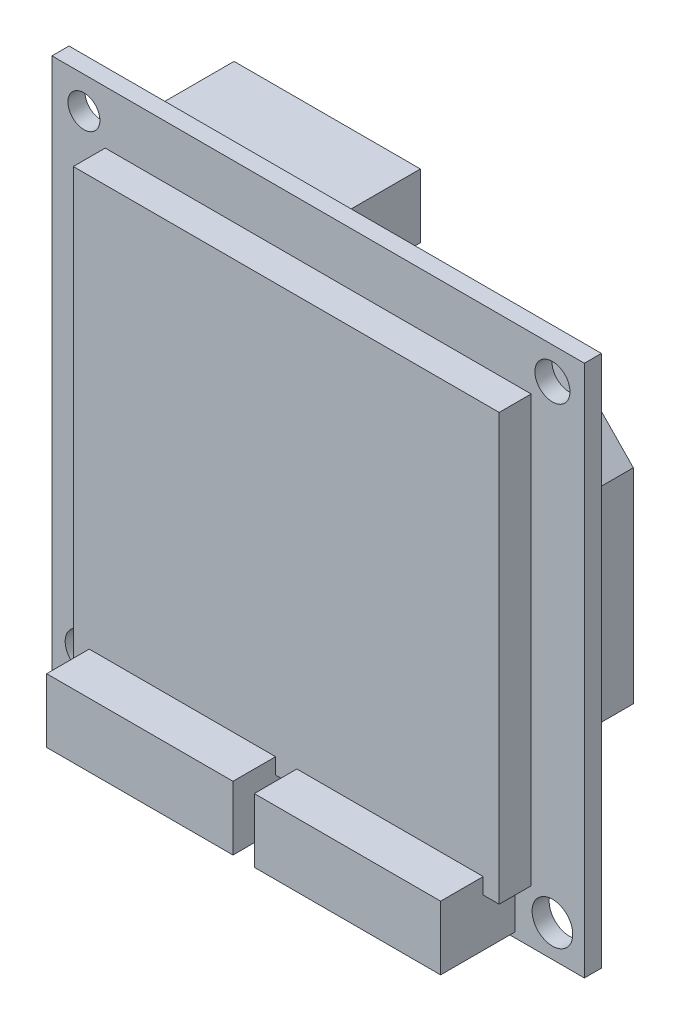
ISO-10303-21;
HEADER;
FILE_DESCRIPTION(('STEP AP214'),'2;1');
FILE_NAME('part.step','',(''),(''),'','','');
FILE_SCHEMA(('AUTOMOTIVE_DESIGN { 1 0 10303 214 1 1 1 1 }'));
ENDSEC;
DATA;
#1=APPLICATION_CONTEXT('core data for automotive mechanical design processes');
#2=APPLICATION_PROTOCOL_DEFINITION('international standard','automotive_design',2000,#1);
#3=PRODUCT_CONTEXT('',#1,'mechanical');
#4=PRODUCT('Part','Part','',(#3));
#5=PRODUCT_RELATED_PRODUCT_CATEGORY('part','',(#4));
#6=PRODUCT_DEFINITION_FORMATION('','',#4);
#7=PRODUCT_DEFINITION_CONTEXT('part definition',#1,'design');
#8=PRODUCT_DEFINITION('design','',#6,#7);
#9=PRODUCT_DEFINITION_SHAPE('','',#8);
#10=(LENGTH_UNIT() NAMED_UNIT(*) SI_UNIT(.MILLI.,.METRE.));
#11=(NAMED_UNIT(*) PLANE_ANGLE_UNIT() SI_UNIT($,.RADIAN.));
#12=(NAMED_UNIT(*) SI_UNIT($,.STERADIAN.) SOLID_ANGLE_UNIT());
#13=UNCERTAINTY_MEASURE_WITH_UNIT(LENGTH_MEASURE(1.E-05),#10,'distance_accuracy_value','');
#14=(GEOMETRIC_REPRESENTATION_CONTEXT(3) GLOBAL_UNCERTAINTY_ASSIGNED_CONTEXT((#13)) GLOBAL_UNIT_ASSIGNED_CONTEXT((#10,
#11,#12)) REPRESENTATION_CONTEXT('',''));
#15=CARTESIAN_POINT('',(0.,0.,0.));
#16=DIRECTION('',(0.,0.,1.));
#17=DIRECTION('',(1.,0.,0.));
#18=AXIS2_PLACEMENT_3D('',#15,#16,#17);
#19=CARTESIAN_POINT('',(0.,-55.1414213562373,-0.8));
#20=DIRECTION('',(0.,0.,1.));
#21=DIRECTION('',(1.,0.,0.));
#22=AXIS2_PLACEMENT_3D('',#19,#20,#21);
#23=PLANE('',#22);
#24=DIRECTION('',(-1.,0.,0.));
#25=VECTOR('',#24,1.);
#26=CARTESIAN_POINT('',(-4.00000000000001,-9.99999999999999,-0.8));
#27=LINE('',#26,#25);
#28=CARTESIAN_POINT('',(20.,-10.,-0.8));
#29=VERTEX_POINT('',#28);
#30=CARTESIAN_POINT('',(-4.00000000000001,-9.99999999999999,-0.8));
#31=VERTEX_POINT('',#30);
#32=EDGE_CURVE('E318',#29,#31,#27,.T.);
#33=ORIENTED_EDGE('',*,*,#32,.F.);
#34=DIRECTION('',(0.,-1.,0.));
#35=VECTOR('',#34,1.);
#36=CARTESIAN_POINT('',(20.,-10.,-0.8));
#37=LINE('',#36,#35);
#38=CARTESIAN_POINT('',(20.,9.19999999999999,-0.8));
#39=VERTEX_POINT('',#38);
#40=EDGE_CURVE('E323',#39,#29,#37,.T.);
#41=ORIENTED_EDGE('',*,*,#40,.F.);
#42=DIRECTION('',(0.697864726910429,-0.716229588144914,0.));
#43=VECTOR('',#42,1.);
#44=CARTESIAN_POINT('',(20.,9.2,-0.8));
#45=LINE('',#44,#43);
#46=CARTESIAN_POINT('',(12.4,17.,-0.8));
#47=VERTEX_POINT('',#46);
#48=EDGE_CURVE('E345',#47,#39,#45,.T.);
#49=ORIENTED_EDGE('',*,*,#48,.F.);
#50=DIRECTION('',(1.,0.,0.));
#51=VECTOR('',#50,1.);
#52=CARTESIAN_POINT('',(12.4,17.,-0.8));
#53=LINE('',#52,#51);
#54=CARTESIAN_POINT('',(3.59999999999999,17.,-0.8));
#55=VERTEX_POINT('',#54);
#56=EDGE_CURVE('E342',#55,#47,#53,.T.);
#57=ORIENTED_EDGE('',*,*,#56,.F.);
#58=DIRECTION('',(0.697864726910428,0.716229588144914,0.));
#59=VECTOR('',#58,1.);
#60=CARTESIAN_POINT('',(3.59999999999999,17.,-0.8));
#61=LINE('',#60,#59);
#62=CARTESIAN_POINT('',(-4.,9.2,-0.8));
#63=VERTEX_POINT('',#62);
#64=EDGE_CURVE('E339',#63,#55,#61,.T.);
#65=ORIENTED_EDGE('',*,*,#64,.F.);
#66=DIRECTION('',(0.,1.,0.));
#67=VECTOR('',#66,1.);
#68=CARTESIAN_POINT('',(-4.00000000000001,9.2,-0.8));
#69=LINE('',#68,#67);
#70=EDGE_CURVE('E336',#31,#63,#69,.T.);
#71=ORIENTED_EDGE('',*,*,#70,.F.);
#72=EDGE_LOOP('',(#33,#41,#49,#57,#65,#71));
#73=FACE_BOUND('',#72,.T.);
#74=DIRECTION('',(-1.,0.,0.));
#75=VECTOR('',#74,1.);
#76=CARTESIAN_POINT('',(0.,-25.,-0.8));
#77=LINE('',#76,#75);
#78=CARTESIAN_POINT('',(25.,-25.,-0.8));
#79=VERTEX_POINT('',#78);
#80=CARTESIAN_POINT('',(-25.,-25.,-0.8));
#81=VERTEX_POINT('',#80);
#82=EDGE_CURVE('E404',#79,#81,#77,.T.);
#83=ORIENTED_EDGE('',*,*,#82,.T.);
#84=DIRECTION('',(0.,1.,0.));
#85=VECTOR('',#84,1.);
#86=CARTESIAN_POINT('',(-25.,-55.1414213562373,-0.8));
#87=LINE('',#86,#85);
#88=CARTESIAN_POINT('',(-25.,25.,-0.8));
#89=VERTEX_POINT('',#88);
#90=EDGE_CURVE('E439',#81,#89,#87,.T.);
#91=ORIENTED_EDGE('',*,*,#90,.T.);
#92=DIRECTION('',(1.,0.,0.));
#93=VECTOR('',#92,1.);
#94=CARTESIAN_POINT('',(0.,25.,-0.8));
#95=LINE('',#94,#93);
#96=CARTESIAN_POINT('',(25.,25.,-0.8));
#97=VERTEX_POINT('',#96);
#98=EDGE_CURVE('E436',#89,#97,#95,.T.);
#99=ORIENTED_EDGE('',*,*,#98,.T.);
#100=DIRECTION('',(0.,-1.,0.));
#101=VECTOR('',#100,1.);
#102=CARTESIAN_POINT('',(25.,-55.1414213562373,-0.8));
#103=LINE('',#102,#101);
#104=EDGE_CURVE('E433',#97,#79,#103,.T.);
#105=ORIENTED_EDGE('',*,*,#104,.T.);
#106=EDGE_LOOP('',(#83,#91,#99,#105));
#107=FACE_BOUND('',#106,.T.);
#108=CARTESIAN_POINT('',(-22.,22.,-0.8));
#109=DIRECTION('',(0.,0.,1.));
#110=DIRECTION('',(1.,0.,0.));
#111=AXIS2_PLACEMENT_3D('',#108,#109,#110);
#112=CIRCLE('',#111,1.5);
#113=CARTESIAN_POINT('',(-20.5,22.,-0.8));
#114=VERTEX_POINT('',#113);
#115=EDGE_CURVE('E442',#114,#114,#112,.T.);
#116=ORIENTED_EDGE('',*,*,#115,.T.);
#117=EDGE_LOOP('',(#116));
#118=FACE_BOUND('',#117,.T.);
#119=CARTESIAN_POINT('',(22.,-22.,-0.8));
#120=DIRECTION('',(0.,0.,1.));
#121=DIRECTION('',(1.,0.,0.));
#122=AXIS2_PLACEMENT_3D('',#119,#120,#121);
#123=CIRCLE('',#122,1.90819247149676);
#124=CARTESIAN_POINT('',(23.9081924714968,-22.,-0.8));
#125=VERTEX_POINT('',#124);
#126=EDGE_CURVE('E445',#125,#125,#123,.T.);
#127=ORIENTED_EDGE('',*,*,#126,.T.);
#128=EDGE_LOOP('',(#127));
#129=FACE_BOUND('',#128,.T.);
#130=CARTESIAN_POINT('',(22.,22.,-0.8));
#131=DIRECTION('',(0.,0.,1.));
#132=DIRECTION('',(1.,0.,0.));
#133=AXIS2_PLACEMENT_3D('',#130,#131,#132);
#134=CIRCLE('',#133,1.64693502393852);
#135=CARTESIAN_POINT('',(23.6469350239385,22.,-0.8));
#136=VERTEX_POINT('',#135);
#137=EDGE_CURVE('E448',#136,#136,#134,.T.);
#138=ORIENTED_EDGE('',*,*,#137,.T.);
#139=EDGE_LOOP('',(#138));
#140=FACE_BOUND('',#139,.T.);
#141=CARTESIAN_POINT('',(-22.,-22.,-0.8));
#142=DIRECTION('',(0.,0.,1.));
#143=DIRECTION('',(1.,0.,0.));
#144=AXIS2_PLACEMENT_3D('',#141,#142,#143);
#145=CIRCLE('',#144,1.75908055301192);
#146=CARTESIAN_POINT('',(-20.2409194469881,-22.,-0.8));
#147=VERTEX_POINT('',#146);
#148=EDGE_CURVE('E409',#147,#147,#145,.T.);
#149=ORIENTED_EDGE('',*,*,#148,.T.);
#150=EDGE_LOOP('',(#149));
#151=FACE_BOUND('',#150,.T.);
#152=DIRECTION('',(0.,-1.,0.));
#153=VECTOR('',#152,1.);
#154=CARTESIAN_POINT('',(0.999999999999994,24.5,-0.8));
#155=LINE('',#154,#153);
#156=CARTESIAN_POINT('',(0.999999999999994,24.5,-0.8));
#157=VERTEX_POINT('',#156);
#158=CARTESIAN_POINT('',(0.999999999999993,18.5,-0.8));
#159=VERTEX_POINT('',#158);
#160=EDGE_CURVE('E248',#157,#159,#155,.T.);
#161=ORIENTED_EDGE('',*,*,#160,.F.);
#162=DIRECTION('',(1.,0.,0.));
#163=VECTOR('',#162,1.);
#164=CARTESIAN_POINT('',(0.999999999999994,24.5,-0.8));
#165=LINE('',#164,#163);
#166=CARTESIAN_POINT('',(-16.5,24.5,-0.8));
#167=VERTEX_POINT('',#166);
#168=EDGE_CURVE('E245',#167,#157,#165,.T.);
#169=ORIENTED_EDGE('',*,*,#168,.F.);
#170=DIRECTION('',(0.,1.,0.));
#171=VECTOR('',#170,1.);
#172=CARTESIAN_POINT('',(-16.5,24.5,-0.8));
#173=LINE('',#172,#171);
#174=CARTESIAN_POINT('',(-16.5,18.5,-0.8));
#175=VERTEX_POINT('',#174);
#176=EDGE_CURVE('E51',#175,#167,#173,.T.);
#177=ORIENTED_EDGE('',*,*,#176,.F.);
#178=DIRECTION('',(-1.,0.,0.));
#179=VECTOR('',#178,1.);
#180=CARTESIAN_POINT('',(0.999999999999993,18.5,-0.8));
#181=LINE('',#180,#179);
#182=EDGE_CURVE('E46',#159,#175,#181,.T.);
#183=ORIENTED_EDGE('',*,*,#182,.F.);
#184=EDGE_LOOP('',(#161,#169,#177,#183));
#185=FACE_BOUND('',#184,.T.);
#186=ADVANCED_FACE('F31',(#73,#107,#118,#129,#140,#151,#185),#23,.F.);
#187=CARTESIAN_POINT('',(0.,-55.1414213562373,0.8));
#188=DIRECTION('',(0.,0.,1.));
#189=DIRECTION('',(1.,0.,0.));
#190=AXIS2_PLACEMENT_3D('',#187,#188,#189);
#191=PLANE('',#190);
#192=DIRECTION('',(-1.,0.,0.));
#193=VECTOR('',#192,1.);
#194=CARTESIAN_POINT('',(0.,-25.,0.8));
#195=LINE('',#194,#193);
#196=CARTESIAN_POINT('',(25.,-25.,0.8));
#197=VERTEX_POINT('',#196);
#198=CARTESIAN_POINT('',(-25.,-25.,0.8));
#199=VERTEX_POINT('',#198);
#200=EDGE_CURVE('E405',#197,#199,#195,.T.);
#201=ORIENTED_EDGE('',*,*,#200,.F.);
#202=DIRECTION('',(0.,-1.,0.));
#203=VECTOR('',#202,1.);
#204=CARTESIAN_POINT('',(25.,-55.1414213562373,0.8));
#205=LINE('',#204,#203);
#206=CARTESIAN_POINT('',(25.,25.,0.8));
#207=VERTEX_POINT('',#206);
#208=EDGE_CURVE('E408',#207,#197,#205,.T.);
#209=ORIENTED_EDGE('',*,*,#208,.F.);
#210=DIRECTION('',(1.,0.,0.));
#211=VECTOR('',#210,1.);
#212=CARTESIAN_POINT('',(0.,25.,0.8));
#213=LINE('',#212,#211);
#214=CARTESIAN_POINT('',(-25.,25.,0.8));
#215=VERTEX_POINT('',#214);
#216=EDGE_CURVE('E412',#215,#207,#213,.T.);
#217=ORIENTED_EDGE('',*,*,#216,.F.);
#218=DIRECTION('',(0.,1.,0.));
#219=VECTOR('',#218,1.);
#220=CARTESIAN_POINT('',(-25.,-55.1414213562373,0.8));
#221=LINE('',#220,#219);
#222=EDGE_CURVE('E415',#199,#215,#221,.T.);
#223=ORIENTED_EDGE('',*,*,#222,.F.);
#224=EDGE_LOOP('',(#201,#209,#217,#223));
#225=FACE_BOUND('',#224,.T.);
#226=CARTESIAN_POINT('',(-22.,22.,0.8));
#227=DIRECTION('',(0.,0.,1.));
#228=DIRECTION('',(1.,0.,0.));
#229=AXIS2_PLACEMENT_3D('',#226,#227,#228);
#230=CIRCLE('',#229,1.5);
#231=CARTESIAN_POINT('',(-20.5,22.,0.8));
#232=VERTEX_POINT('',#231);
#233=EDGE_CURVE('E418',#232,#232,#230,.T.);
#234=ORIENTED_EDGE('',*,*,#233,.F.);
#235=EDGE_LOOP('',(#234));
#236=FACE_BOUND('',#235,.T.);
#237=CARTESIAN_POINT('',(22.,-22.,0.8));
#238=DIRECTION('',(0.,0.,1.));
#239=DIRECTION('',(1.,0.,0.));
#240=AXIS2_PLACEMENT_3D('',#237,#238,#239);
#241=CIRCLE('',#240,1.90819247149676);
#242=CARTESIAN_POINT('',(23.9081924714968,-22.,0.8));
#243=VERTEX_POINT('',#242);
#244=EDGE_CURVE('E421',#243,#243,#241,.T.);
#245=ORIENTED_EDGE('',*,*,#244,.F.);
#246=EDGE_LOOP('',(#245));
#247=FACE_BOUND('',#246,.T.);
#248=CARTESIAN_POINT('',(22.,22.,0.8));
#249=DIRECTION('',(0.,0.,1.));
#250=DIRECTION('',(1.,0.,0.));
#251=AXIS2_PLACEMENT_3D('',#248,#249,#250);
#252=CIRCLE('',#251,1.64693502393852);
#253=CARTESIAN_POINT('',(23.6469350239385,22.,0.8));
#254=VERTEX_POINT('',#253);
#255=EDGE_CURVE('E424',#254,#254,#252,.T.);
#256=ORIENTED_EDGE('',*,*,#255,.F.);
#257=EDGE_LOOP('',(#256));
#258=FACE_BOUND('',#257,.T.);
#259=CARTESIAN_POINT('',(-22.,-22.,0.8));
#260=DIRECTION('',(0.,0.,1.));
#261=DIRECTION('',(1.,0.,0.));
#262=AXIS2_PLACEMENT_3D('',#259,#260,#261);
#263=CIRCLE('',#262,1.75908055301192);
#264=CARTESIAN_POINT('',(-20.2409194469881,-22.,0.8));
#265=VERTEX_POINT('',#264);
#266=EDGE_CURVE('E427',#265,#265,#263,.T.);
#267=ORIENTED_EDGE('',*,*,#266,.F.);
#268=EDGE_LOOP('',(#267));
#269=FACE_BOUND('',#268,.T.);
#270=DIRECTION('',(-1.,0.,0.));
#271=VECTOR('',#270,1.);
#272=CARTESIAN_POINT('',(0.,-20.,0.8));
#273=LINE('',#272,#271);
#274=CARTESIAN_POINT('',(0.999999999999994,-20.,0.8));
#275=VERTEX_POINT('',#274);
#276=CARTESIAN_POINT('',(-1.00000000000001,-20.,0.8));
#277=VERTEX_POINT('',#276);
#278=EDGE_CURVE('E387',#275,#277,#273,.T.);
#279=ORIENTED_EDGE('',*,*,#278,.T.);
#280=DIRECTION('',(0.,1.,0.));
#281=VECTOR('',#280,1.);
#282=CARTESIAN_POINT('',(-1.00000000000001,-24.5,0.8));
#283=LINE('',#282,#281);
#284=CARTESIAN_POINT('',(-1.00000000000001,-24.5,0.8));
#285=VERTEX_POINT('',#284);
#286=EDGE_CURVE('E249',#285,#277,#283,.T.);
#287=ORIENTED_EDGE('',*,*,#286,.F.);
#288=DIRECTION('',(1.,0.,0.));
#289=VECTOR('',#288,1.);
#290=CARTESIAN_POINT('',(-1.00000000000001,-24.5,0.8));
#291=LINE('',#290,#289);
#292=CARTESIAN_POINT('',(-18.5,-24.5,0.8));
#293=VERTEX_POINT('',#292);
#294=EDGE_CURVE('E261',#293,#285,#291,.T.);
#295=ORIENTED_EDGE('',*,*,#294,.F.);
#296=DIRECTION('',(0.,-1.,0.));
#297=VECTOR('',#296,1.);
#298=CARTESIAN_POINT('',(-18.5,-24.5,0.8));
#299=LINE('',#298,#297);
#300=CARTESIAN_POINT('',(-18.5,-20.,0.8));
#301=VERTEX_POINT('',#300);
#302=EDGE_CURVE('E251',#301,#293,#299,.T.);
#303=ORIENTED_EDGE('',*,*,#302,.F.);
#304=CARTESIAN_POINT('',(-20.,-20.,0.8));
#305=VERTEX_POINT('',#304);
#306=EDGE_CURVE('E367',#301,#305,#273,.T.);
#307=ORIENTED_EDGE('',*,*,#306,.T.);
#308=DIRECTION('',(0.,1.,0.));
#309=VECTOR('',#308,1.);
#310=CARTESIAN_POINT('',(-20.,-55.1414213562373,0.8));
#311=LINE('',#310,#309);
#312=CARTESIAN_POINT('',(-20.,20.,0.8));
#313=VERTEX_POINT('',#312);
#314=EDGE_CURVE('E391',#305,#313,#311,.T.);
#315=ORIENTED_EDGE('',*,*,#314,.T.);
#316=DIRECTION('',(1.,0.,0.));
#317=VECTOR('',#316,1.);
#318=CARTESIAN_POINT('',(0.,20.,0.8));
#319=LINE('',#318,#317);
#320=CARTESIAN_POINT('',(20.,20.,0.8));
#321=VERTEX_POINT('',#320);
#322=EDGE_CURVE('E389',#313,#321,#319,.T.);
#323=ORIENTED_EDGE('',*,*,#322,.T.);
#324=DIRECTION('',(0.,-1.,0.));
#325=VECTOR('',#324,1.);
#326=CARTESIAN_POINT('',(20.,-55.1414213562373,0.8));
#327=LINE('',#326,#325);
#328=CARTESIAN_POINT('',(20.,-20.,0.8));
#329=VERTEX_POINT('',#328);
#330=EDGE_CURVE('E386',#321,#329,#327,.T.);
#331=ORIENTED_EDGE('',*,*,#330,.T.);
#332=CARTESIAN_POINT('',(18.5,-20.,0.8));
#333=VERTEX_POINT('',#332);
#334=EDGE_CURVE('E383',#329,#333,#273,.T.);
#335=ORIENTED_EDGE('',*,*,#334,.T.);
#336=DIRECTION('',(0.,1.,0.));
#337=VECTOR('',#336,1.);
#338=CARTESIAN_POINT('',(18.5,-24.5,0.8));
#339=LINE('',#338,#337);
#340=CARTESIAN_POINT('',(18.5,-24.5,0.8));
#341=VERTEX_POINT('',#340);
#342=EDGE_CURVE('E286',#341,#333,#339,.T.);
#343=ORIENTED_EDGE('',*,*,#342,.F.);
#344=DIRECTION('',(1.,0.,0.));
#345=VECTOR('',#344,1.);
#346=CARTESIAN_POINT('',(18.5,-24.5,0.8));
#347=LINE('',#346,#345);
#348=CARTESIAN_POINT('',(0.999999999999994,-24.5,0.8));
#349=VERTEX_POINT('',#348);
#350=EDGE_CURVE('E291',#349,#341,#347,.T.);
#351=ORIENTED_EDGE('',*,*,#350,.F.);
#352=DIRECTION('',(0.,-1.,0.));
#353=VECTOR('',#352,1.);
#354=CARTESIAN_POINT('',(0.999999999999994,-24.5,0.8));
#355=LINE('',#354,#353);
#356=EDGE_CURVE('E299',#275,#349,#355,.T.);
#357=ORIENTED_EDGE('',*,*,#356,.F.);
#358=EDGE_LOOP('',(#279,#287,#295,#303,#307,#315,#323,#331,#335,#343,#351,#357));
#359=FACE_BOUND('',#358,.T.);
#360=ADVANCED_FACE('F493',(#225,#236,#247,#258,#269,#359),#191,.T.);
#361=CARTESIAN_POINT('',(0.,-20.,3.8));
#362=DIRECTION('',(0.,-1.,0.));
#363=DIRECTION('',(1.,0.,0.));
#364=AXIS2_PLACEMENT_3D('',#361,#362,#363);
#365=PLANE('',#364);
#366=DIRECTION('',(-1.,0.,0.));
#367=VECTOR('',#366,1.);
#368=CARTESIAN_POINT('',(0.,-20.,3.8));
#369=LINE('',#368,#367);
#370=CARTESIAN_POINT('',(0.999999999999994,-20.,3.8));
#371=VERTEX_POINT('',#370);
#372=CARTESIAN_POINT('',(-1.00000000000001,-20.,3.8));
#373=VERTEX_POINT('',#372);
#374=EDGE_CURVE('E372',#371,#373,#369,.T.);
#375=ORIENTED_EDGE('',*,*,#374,.T.);
#376=DIRECTION('',(0.,0.,-1.));
#377=VECTOR('',#376,1.);
#378=CARTESIAN_POINT('',(-1.00000000000001,-20.,3.8));
#379=LINE('',#378,#377);
#380=EDGE_CURVE('E283',#373,#277,#379,.T.);
#381=ORIENTED_EDGE('',*,*,#380,.T.);
#382=ORIENTED_EDGE('',*,*,#278,.F.);
#383=DIRECTION('',(0.,0.,1.));
#384=VECTOR('',#383,1.);
#385=CARTESIAN_POINT('',(0.999999999999994,-20.,3.8));
#386=LINE('',#385,#384);
#387=EDGE_CURVE('E312',#275,#371,#386,.T.);
#388=ORIENTED_EDGE('',*,*,#387,.T.);
#389=EDGE_LOOP('',(#375,#381,#382,#388));
#390=FACE_BOUND('',#389,.T.);
#391=ADVANCED_FACE('F490',(#390),#365,.T.);
#392=ORIENTED_EDGE('',*,*,#306,.F.);
#393=DIRECTION('',(0.,0.,1.));
#394=VECTOR('',#393,1.);
#395=CARTESIAN_POINT('',(-18.5,-20.,3.8));
#396=LINE('',#395,#394);
#397=CARTESIAN_POINT('',(-18.5,-20.,3.8));
#398=VERTEX_POINT('',#397);
#399=EDGE_CURVE('E280',#301,#398,#396,.T.);
#400=ORIENTED_EDGE('',*,*,#399,.T.);
#401=CARTESIAN_POINT('',(-20.,-20.,3.8));
#402=VERTEX_POINT('',#401);
#403=EDGE_CURVE('E373',#398,#402,#369,.T.);
#404=ORIENTED_EDGE('',*,*,#403,.T.);
#405=DIRECTION('',(0.,0.,-1.));
#406=VECTOR('',#405,1.);
#407=CARTESIAN_POINT('',(-20.,-20.,3.8));
#408=LINE('',#407,#406);
#409=EDGE_CURVE('E382',#402,#305,#408,.T.);
#410=ORIENTED_EDGE('',*,*,#409,.T.);
#411=EDGE_LOOP('',(#392,#400,#404,#410));
#412=FACE_BOUND('',#411,.T.);
#413=ADVANCED_FACE('F501',(#412),#365,.T.);
#414=CARTESIAN_POINT('',(0.,-55.1414213562373,3.8));
#415=DIRECTION('',(0.,0.,1.));
#416=DIRECTION('',(1.,0.,0.));
#417=AXIS2_PLACEMENT_3D('',#414,#415,#416);
#418=PLANE('',#417);
#419=DIRECTION('',(1.,0.,0.));
#420=VECTOR('',#419,1.);
#421=CARTESIAN_POINT('',(0.,-18.5,3.8));
#422=LINE('',#421,#420);
#423=CARTESIAN_POINT('',(-18.5,-18.5,3.8));
#424=VERTEX_POINT('',#423);
#425=CARTESIAN_POINT('',(-1.00000000000001,-18.5,3.8));
#426=VERTEX_POINT('',#425);
#427=EDGE_CURVE('E39',#424,#426,#422,.T.);
#428=ORIENTED_EDGE('',*,*,#427,.T.);
#429=DIRECTION('',(0.,-1.,0.));
#430=VECTOR('',#429,1.);
#431=CARTESIAN_POINT('',(-1.00000000000001,-55.1414213562373,3.8));
#432=LINE('',#431,#430);
#433=EDGE_CURVE('E11',#426,#373,#432,.T.);
#434=ORIENTED_EDGE('',*,*,#433,.T.);
#435=ORIENTED_EDGE('',*,*,#374,.F.);
#436=DIRECTION('',(0.,1.,0.));
#437=VECTOR('',#436,1.);
#438=CARTESIAN_POINT('',(0.999999999999994,-55.1414213562373,3.8));
#439=LINE('',#438,#437);
#440=CARTESIAN_POINT('',(0.999999999999994,-18.5,3.8));
#441=VERTEX_POINT('',#440);
#442=EDGE_CURVE('E460',#371,#441,#439,.T.);
#443=ORIENTED_EDGE('',*,*,#442,.T.);
#444=DIRECTION('',(1.,0.,0.));
#445=VECTOR('',#444,1.);
#446=CARTESIAN_POINT('',(0.,-18.5,3.8));
#447=LINE('',#446,#445);
#448=CARTESIAN_POINT('',(18.5,-18.5,3.8));
#449=VERTEX_POINT('',#448);
#450=EDGE_CURVE('E463',#441,#449,#447,.T.);
#451=ORIENTED_EDGE('',*,*,#450,.T.);
#452=DIRECTION('',(0.,-1.,0.));
#453=VECTOR('',#452,1.);
#454=CARTESIAN_POINT('',(18.5,-55.1414213562373,3.8));
#455=LINE('',#454,#453);
#456=CARTESIAN_POINT('',(18.5,-20.,3.8));
#457=VERTEX_POINT('',#456);
#458=EDGE_CURVE('E466',#449,#457,#455,.T.);
#459=ORIENTED_EDGE('',*,*,#458,.T.);
#460=CARTESIAN_POINT('',(20.,-20.,3.8));
#461=VERTEX_POINT('',#460);
#462=EDGE_CURVE('E368',#461,#457,#369,.T.);
#463=ORIENTED_EDGE('',*,*,#462,.F.);
#464=DIRECTION('',(0.,-1.,0.));
#465=VECTOR('',#464,1.);
#466=CARTESIAN_POINT('',(20.,-55.1414213562373,3.8));
#467=LINE('',#466,#465);
#468=CARTESIAN_POINT('',(20.,20.,3.8));
#469=VERTEX_POINT('',#468);
#470=EDGE_CURVE('E371',#469,#461,#467,.T.);
#471=ORIENTED_EDGE('',*,*,#470,.F.);
#472=DIRECTION('',(1.,0.,0.));
#473=VECTOR('',#472,1.);
#474=CARTESIAN_POINT('',(0.,20.,3.8));
#475=LINE('',#474,#473);
#476=CARTESIAN_POINT('',(-20.,20.,3.8));
#477=VERTEX_POINT('',#476);
#478=EDGE_CURVE('E376',#477,#469,#475,.T.);
#479=ORIENTED_EDGE('',*,*,#478,.F.);
#480=DIRECTION('',(0.,1.,0.));
#481=VECTOR('',#480,1.);
#482=CARTESIAN_POINT('',(-20.,-55.1414213562373,3.8));
#483=LINE('',#482,#481);
#484=EDGE_CURVE('E379',#402,#477,#483,.T.);
#485=ORIENTED_EDGE('',*,*,#484,.F.);
#486=ORIENTED_EDGE('',*,*,#403,.F.);
#487=DIRECTION('',(0.,1.,0.));
#488=VECTOR('',#487,1.);
#489=CARTESIAN_POINT('',(-18.5,-55.1414213562373,3.8));
#490=LINE('',#489,#488);
#491=EDGE_CURVE('E469',#398,#424,#490,.T.);
#492=ORIENTED_EDGE('',*,*,#491,.T.);
#493=EDGE_LOOP('',(#428,#434,#435,#443,#451,#459,#463,#471,#479,#485,#486,#492));
#494=FACE_BOUND('',#493,.T.);
#495=ADVANCED_FACE('F474',(#494),#418,.T.);
#496=ORIENTED_EDGE('',*,*,#462,.T.);
#497=DIRECTION('',(0.,0.,-1.));
#498=VECTOR('',#497,1.);
#499=CARTESIAN_POINT('',(18.5,-20.,3.8));
#500=LINE('',#499,#498);
#501=EDGE_CURVE('E315',#457,#333,#500,.T.);
#502=ORIENTED_EDGE('',*,*,#501,.T.);
#503=ORIENTED_EDGE('',*,*,#334,.F.);
#504=DIRECTION('',(0.,0.,-1.));
#505=VECTOR('',#504,1.);
#506=CARTESIAN_POINT('',(20.,-20.,3.8));
#507=LINE('',#506,#505);
#508=EDGE_CURVE('E401',#461,#329,#507,.T.);
#509=ORIENTED_EDGE('',*,*,#508,.F.);
#510=EDGE_LOOP('',(#496,#502,#503,#509));
#511=FACE_BOUND('',#510,.T.);
#512=ADVANCED_FACE('F517',(#511),#365,.T.);
#513=CARTESIAN_POINT('',(0.,-25.,0.8));
#514=DIRECTION('',(0.,-1.,0.));
#515=DIRECTION('',(1.,0.,0.));
#516=AXIS2_PLACEMENT_3D('',#513,#514,#515);
#517=PLANE('',#516);
#518=ORIENTED_EDGE('',*,*,#82,.F.);
#519=DIRECTION('',(0.,0.,-1.));
#520=VECTOR('',#519,1.);
#521=CARTESIAN_POINT('',(25.,-25.,0.8));
#522=LINE('',#521,#520);
#523=EDGE_CURVE('E458',#197,#79,#522,.T.);
#524=ORIENTED_EDGE('',*,*,#523,.F.);
#525=ORIENTED_EDGE('',*,*,#200,.T.);
#526=DIRECTION('',(0.,0.,-1.));
#527=VECTOR('',#526,1.);
#528=CARTESIAN_POINT('',(-25.,-25.,0.8));
#529=LINE('',#528,#527);
#530=EDGE_CURVE('E430',#199,#81,#529,.T.);
#531=ORIENTED_EDGE('',*,*,#530,.T.);
#532=EDGE_LOOP('',(#518,#524,#525,#531));
#533=FACE_BOUND('',#532,.T.);
#534=ADVANCED_FACE('F33',(#533),#517,.T.);
#535=CARTESIAN_POINT('',(25.,-55.1414213562373,0.8));
#536=DIRECTION('',(1.,0.,0.));
#537=DIRECTION('',(0.,1.,0.));
#538=AXIS2_PLACEMENT_3D('',#535,#536,#537);
#539=PLANE('',#538);
#540=ORIENTED_EDGE('',*,*,#104,.F.);
#541=DIRECTION('',(0.,0.,-1.));
#542=VECTOR('',#541,1.);
#543=CARTESIAN_POINT('',(25.,25.,0.8));
#544=LINE('',#543,#542);
#545=EDGE_CURVE('E456',#207,#97,#544,.T.);
#546=ORIENTED_EDGE('',*,*,#545,.F.);
#547=ORIENTED_EDGE('',*,*,#208,.T.);
#548=ORIENTED_EDGE('',*,*,#523,.T.);
#549=EDGE_LOOP('',(#540,#546,#547,#548));
#550=FACE_BOUND('',#549,.T.);
#551=ADVANCED_FACE('F577',(#550),#539,.T.);
#552=CARTESIAN_POINT('',(0.,25.,0.8));
#553=DIRECTION('',(0.,1.,0.));
#554=DIRECTION('',(0.,0.,1.));
#555=AXIS2_PLACEMENT_3D('',#552,#553,#554);
#556=PLANE('',#555);
#557=ORIENTED_EDGE('',*,*,#98,.F.);
#558=DIRECTION('',(0.,0.,-1.));
#559=VECTOR('',#558,1.);
#560=CARTESIAN_POINT('',(-25.,25.,0.8));
#561=LINE('',#560,#559);
#562=EDGE_CURVE('E454',#215,#89,#561,.T.);
#563=ORIENTED_EDGE('',*,*,#562,.F.);
#564=ORIENTED_EDGE('',*,*,#216,.T.);
#565=ORIENTED_EDGE('',*,*,#545,.T.);
#566=EDGE_LOOP('',(#557,#563,#564,#565));
#567=FACE_BOUND('',#566,.T.);
#568=ADVANCED_FACE('F564',(#567),#556,.T.);
#569=CARTESIAN_POINT('',(22.,22.,0.8));
#570=DIRECTION('',(0.,0.,-1.));
#571=DIRECTION('',(-1.,0.,0.));
#572=AXIS2_PLACEMENT_3D('',#569,#570,#571);
#573=CYLINDRICAL_SURFACE('',#572,1.64693502393852);
#574=ORIENTED_EDGE('',*,*,#255,.T.);
#575=EDGE_LOOP('',(#574));
#576=FACE_BOUND('',#575,.T.);
#577=ORIENTED_EDGE('',*,*,#137,.F.);
#578=EDGE_LOOP('',(#577));
#579=FACE_BOUND('',#578,.T.);
#580=ADVANCED_FACE('F560',(#576,#579),#573,.F.);
#581=CARTESIAN_POINT('',(22.,-22.,0.8));
#582=DIRECTION('',(0.,0.,-1.));
#583=DIRECTION('',(-1.,0.,0.));
#584=AXIS2_PLACEMENT_3D('',#581,#582,#583);
#585=CYLINDRICAL_SURFACE('',#584,1.90819247149676);
#586=ORIENTED_EDGE('',*,*,#244,.T.);
#587=EDGE_LOOP('',(#586));
#588=FACE_BOUND('',#587,.T.);
#589=ORIENTED_EDGE('',*,*,#126,.F.);
#590=EDGE_LOOP('',(#589));
#591=FACE_BOUND('',#590,.T.);
#592=ADVANCED_FACE('F563',(#588,#591),#585,.F.);
#593=CARTESIAN_POINT('',(-22.,22.,0.8));
#594=DIRECTION('',(0.,0.,-1.));
#595=DIRECTION('',(-1.,0.,0.));
#596=AXIS2_PLACEMENT_3D('',#593,#594,#595);
#597=CYLINDRICAL_SURFACE('',#596,1.5);
#598=ORIENTED_EDGE('',*,*,#233,.T.);
#599=EDGE_LOOP('',(#598));
#600=FACE_BOUND('',#599,.T.);
#601=ORIENTED_EDGE('',*,*,#115,.F.);
#602=EDGE_LOOP('',(#601));
#603=FACE_BOUND('',#602,.T.);
#604=ADVANCED_FACE('F568',(#600,#603),#597,.F.);
#605=CARTESIAN_POINT('',(-25.,-55.1414213562373,0.8));
#606=DIRECTION('',(-1.,0.,0.));
#607=DIRECTION('',(0.,0.,1.));
#608=AXIS2_PLACEMENT_3D('',#605,#606,#607);
#609=PLANE('',#608);
#610=ORIENTED_EDGE('',*,*,#90,.F.);
#611=ORIENTED_EDGE('',*,*,#530,.F.);
#612=ORIENTED_EDGE('',*,*,#222,.T.);
#613=ORIENTED_EDGE('',*,*,#562,.T.);
#614=EDGE_LOOP('',(#610,#611,#612,#613));
#615=FACE_BOUND('',#614,.T.);
#616=ADVANCED_FACE('F558',(#615),#609,.T.);
#617=CARTESIAN_POINT('',(-22.,-22.,0.8));
#618=DIRECTION('',(0.,0.,-1.));
#619=DIRECTION('',(-1.,0.,0.));
#620=AXIS2_PLACEMENT_3D('',#617,#618,#619);
#621=CYLINDRICAL_SURFACE('',#620,1.75908055301192);
#622=ORIENTED_EDGE('',*,*,#266,.T.);
#623=EDGE_LOOP('',(#622));
#624=FACE_BOUND('',#623,.T.);
#625=ORIENTED_EDGE('',*,*,#148,.F.);
#626=EDGE_LOOP('',(#625));
#627=FACE_BOUND('',#626,.T.);
#628=ADVANCED_FACE('F555',(#624,#627),#621,.F.);
#629=CARTESIAN_POINT('',(20.,-55.1414213562373,3.8));
#630=DIRECTION('',(1.,0.,0.));
#631=DIRECTION('',(0.,1.,0.));
#632=AXIS2_PLACEMENT_3D('',#629,#630,#631);
#633=PLANE('',#632);
#634=ORIENTED_EDGE('',*,*,#330,.F.);
#635=DIRECTION('',(0.,0.,-1.));
#636=VECTOR('',#635,1.);
#637=CARTESIAN_POINT('',(20.,20.,3.8));
#638=LINE('',#637,#636);
#639=EDGE_CURVE('E398',#469,#321,#638,.T.);
#640=ORIENTED_EDGE('',*,*,#639,.F.);
#641=ORIENTED_EDGE('',*,*,#470,.T.);
#642=ORIENTED_EDGE('',*,*,#508,.T.);
#643=EDGE_LOOP('',(#634,#640,#641,#642));
#644=FACE_BOUND('',#643,.T.);
#645=ADVANCED_FACE('F513',(#644),#633,.T.);
#646=CARTESIAN_POINT('',(0.,20.,3.8));
#647=DIRECTION('',(0.,1.,0.));
#648=DIRECTION('',(0.,0.,1.));
#649=AXIS2_PLACEMENT_3D('',#646,#647,#648);
#650=PLANE('',#649);
#651=ORIENTED_EDGE('',*,*,#322,.F.);
#652=DIRECTION('',(0.,0.,-1.));
#653=VECTOR('',#652,1.);
#654=CARTESIAN_POINT('',(-20.,20.,3.8));
#655=LINE('',#654,#653);
#656=EDGE_CURVE('E395',#477,#313,#655,.T.);
#657=ORIENTED_EDGE('',*,*,#656,.F.);
#658=ORIENTED_EDGE('',*,*,#478,.T.);
#659=ORIENTED_EDGE('',*,*,#639,.T.);
#660=EDGE_LOOP('',(#651,#657,#658,#659));
#661=FACE_BOUND('',#660,.T.);
#662=ADVANCED_FACE('F508',(#661),#650,.T.);
#663=CARTESIAN_POINT('',(-20.,-55.1414213562373,3.8));
#664=DIRECTION('',(-1.,0.,0.));
#665=DIRECTION('',(0.,0.,1.));
#666=AXIS2_PLACEMENT_3D('',#663,#664,#665);
#667=PLANE('',#666);
#668=ORIENTED_EDGE('',*,*,#314,.F.);
#669=ORIENTED_EDGE('',*,*,#409,.F.);
#670=ORIENTED_EDGE('',*,*,#484,.T.);
#671=ORIENTED_EDGE('',*,*,#656,.T.);
#672=EDGE_LOOP('',(#668,#669,#670,#671));
#673=FACE_BOUND('',#672,.T.);
#674=ADVANCED_FACE('F504',(#673),#667,.T.);
#675=CARTESIAN_POINT('',(-4.00000000000001,-9.99999999999999,-8.8));
#676=DIRECTION('',(0.,1.,0.));
#677=DIRECTION('',(-1.,0.,0.));
#678=AXIS2_PLACEMENT_3D('',#675,#676,#677);
#679=PLANE('',#678);
#680=ORIENTED_EDGE('',*,*,#32,.T.);
#681=DIRECTION('',(0.,0.,1.));
#682=VECTOR('',#681,1.);
#683=CARTESIAN_POINT('',(-4.00000000000001,-9.99999999999999,-8.8));
#684=LINE('',#683,#682);
#685=CARTESIAN_POINT('',(-4.00000000000001,-9.99999999999999,-8.8));
#686=VERTEX_POINT('',#685);
#687=EDGE_CURVE('E364',#686,#31,#684,.T.);
#688=ORIENTED_EDGE('',*,*,#687,.F.);
#689=DIRECTION('',(-1.,0.,0.));
#690=VECTOR('',#689,1.);
#691=CARTESIAN_POINT('',(-4.00000000000001,-9.99999999999999,-8.8));
#692=LINE('',#691,#690);
#693=CARTESIAN_POINT('',(20.,-10.,-8.8));
#694=VERTEX_POINT('',#693);
#695=EDGE_CURVE('E319',#694,#686,#692,.T.);
#696=ORIENTED_EDGE('',*,*,#695,.F.);
#697=DIRECTION('',(0.,0.,1.));
#698=VECTOR('',#697,1.);
#699=CARTESIAN_POINT('',(20.,-10.,-8.8));
#700=LINE('',#699,#698);
#701=EDGE_CURVE('E333',#694,#29,#700,.T.);
#702=ORIENTED_EDGE('',*,*,#701,.T.);
#703=EDGE_LOOP('',(#680,#688,#696,#702));
#704=FACE_BOUND('',#703,.T.);
#705=ADVANCED_FACE('F855',(#704),#679,.F.);
#706=CARTESIAN_POINT('',(-4.00000000000001,9.2,-8.8));
#707=DIRECTION('',(1.,0.,0.));
#708=DIRECTION('',(0.,1.,0.));
#709=AXIS2_PLACEMENT_3D('',#706,#707,#708);
#710=PLANE('',#709);
#711=ORIENTED_EDGE('',*,*,#70,.T.);
#712=DIRECTION('',(0.,0.,1.));
#713=VECTOR('',#712,1.);
#714=CARTESIAN_POINT('',(-4.00000000000001,9.2,-8.8));
#715=LINE('',#714,#713);
#716=CARTESIAN_POINT('',(-4.00000000000001,9.2,-8.8));
#717=VERTEX_POINT('',#716);
#718=EDGE_CURVE('E361',#717,#63,#715,.T.);
#719=ORIENTED_EDGE('',*,*,#718,.F.);
#720=DIRECTION('',(0.,1.,0.));
#721=VECTOR('',#720,1.);
#722=CARTESIAN_POINT('',(-4.00000000000001,9.2,-8.8));
#723=LINE('',#722,#721);
#724=EDGE_CURVE('E322',#686,#717,#723,.T.);
#725=ORIENTED_EDGE('',*,*,#724,.F.);
#726=ORIENTED_EDGE('',*,*,#687,.T.);
#727=EDGE_LOOP('',(#711,#719,#725,#726));
#728=FACE_BOUND('',#727,.T.);
#729=ADVANCED_FACE('F864',(#728),#710,.F.);
#730=CARTESIAN_POINT('',(3.59999999999999,17.,-8.8));
#731=DIRECTION('',(0.716229588144914,-0.697864726910428,0.));
#732=DIRECTION('',(0.697864726910428,0.716229588144914,0.));
#733=AXIS2_PLACEMENT_3D('',#730,#731,#732);
#734=PLANE('',#733);
#735=ORIENTED_EDGE('',*,*,#64,.T.);
#736=DIRECTION('',(0.,0.,1.));
#737=VECTOR('',#736,1.);
#738=CARTESIAN_POINT('',(3.59999999999999,17.,-8.8));
#739=LINE('',#738,#737);
#740=CARTESIAN_POINT('',(3.59999999999999,17.,-8.8));
#741=VERTEX_POINT('',#740);
#742=EDGE_CURVE('E358',#741,#55,#739,.T.);
#743=ORIENTED_EDGE('',*,*,#742,.F.);
#744=DIRECTION('',(0.697864726910428,0.716229588144914,0.));
#745=VECTOR('',#744,1.);
#746=CARTESIAN_POINT('',(3.59999999999999,17.,-8.8));
#747=LINE('',#746,#745);
#748=EDGE_CURVE('E325',#717,#741,#747,.T.);
#749=ORIENTED_EDGE('',*,*,#748,.F.);
#750=ORIENTED_EDGE('',*,*,#718,.T.);
#751=EDGE_LOOP('',(#735,#743,#749,#750));
#752=FACE_BOUND('',#751,.T.);
#753=ADVANCED_FACE('F874',(#752),#734,.F.);
#754=CARTESIAN_POINT('',(12.4,17.,-8.8));
#755=DIRECTION('',(0.,-1.,0.));
#756=DIRECTION('',(1.,0.,0.));
#757=AXIS2_PLACEMENT_3D('',#754,#755,#756);
#758=PLANE('',#757);
#759=ORIENTED_EDGE('',*,*,#56,.T.);
#760=DIRECTION('',(0.,0.,1.));
#761=VECTOR('',#760,1.);
#762=CARTESIAN_POINT('',(12.4,17.,-8.8));
#763=LINE('',#762,#761);
#764=CARTESIAN_POINT('',(12.4,17.,-8.8));
#765=VERTEX_POINT('',#764);
#766=EDGE_CURVE('E355',#765,#47,#763,.T.);
#767=ORIENTED_EDGE('',*,*,#766,.F.);
#768=DIRECTION('',(1.,0.,0.));
#769=VECTOR('',#768,1.);
#770=CARTESIAN_POINT('',(12.4,17.,-8.8));
#771=LINE('',#770,#769);
#772=EDGE_CURVE('E327',#741,#765,#771,.T.);
#773=ORIENTED_EDGE('',*,*,#772,.F.);
#774=ORIENTED_EDGE('',*,*,#742,.T.);
#775=EDGE_LOOP('',(#759,#767,#773,#774));
#776=FACE_BOUND('',#775,.T.);
#777=ADVANCED_FACE('F884',(#776),#758,.F.);
#778=CARTESIAN_POINT('',(20.,9.2,-8.8));
#779=DIRECTION('',(-0.716229588144914,-0.697864726910429,0.));
#780=DIRECTION('',(0.697864726910429,-0.716229588144914,0.));
#781=AXIS2_PLACEMENT_3D('',#778,#779,#780);
#782=PLANE('',#781);
#783=ORIENTED_EDGE('',*,*,#48,.T.);
#784=DIRECTION('',(0.,0.,1.));
#785=VECTOR('',#784,1.);
#786=CARTESIAN_POINT('',(20.,9.2,-8.8));
#787=LINE('',#786,#785);
#788=CARTESIAN_POINT('',(20.,9.2,-8.8));
#789=VERTEX_POINT('',#788);
#790=EDGE_CURVE('E352',#789,#39,#787,.T.);
#791=ORIENTED_EDGE('',*,*,#790,.F.);
#792=DIRECTION('',(0.697864726910429,-0.716229588144914,0.));
#793=VECTOR('',#792,1.);
#794=CARTESIAN_POINT('',(20.,9.2,-8.8));
#795=LINE('',#794,#793);
#796=EDGE_CURVE('E329',#765,#789,#795,.T.);
#797=ORIENTED_EDGE('',*,*,#796,.F.);
#798=ORIENTED_EDGE('',*,*,#766,.T.);
#799=EDGE_LOOP('',(#783,#791,#797,#798));
#800=FACE_BOUND('',#799,.T.);
#801=ADVANCED_FACE('F894',(#800),#782,.F.);
#802=CARTESIAN_POINT('',(20.,-10.,-8.8));
#803=DIRECTION('',(-1.,0.,0.));
#804=DIRECTION('',(0.,0.,1.));
#805=AXIS2_PLACEMENT_3D('',#802,#803,#804);
#806=PLANE('',#805);
#807=ORIENTED_EDGE('',*,*,#40,.T.);
#808=ORIENTED_EDGE('',*,*,#701,.F.);
#809=DIRECTION('',(0.,-1.,0.));
#810=VECTOR('',#809,1.);
#811=CARTESIAN_POINT('',(20.,-10.,-8.8));
#812=LINE('',#811,#810);
#813=EDGE_CURVE('E331',#789,#694,#812,.T.);
#814=ORIENTED_EDGE('',*,*,#813,.F.);
#815=ORIENTED_EDGE('',*,*,#790,.T.);
#816=EDGE_LOOP('',(#807,#808,#814,#815));
#817=FACE_BOUND('',#816,.T.);
#818=ADVANCED_FACE('F903',(#817),#806,.F.);
#819=CARTESIAN_POINT('',(20.,-10.,-8.8));
#820=DIRECTION('',(0.,0.,1.));
#821=DIRECTION('',(1.,0.,0.));
#822=AXIS2_PLACEMENT_3D('',#819,#820,#821);
#823=PLANE('',#822);
#824=ORIENTED_EDGE('',*,*,#695,.T.);
#825=ORIENTED_EDGE('',*,*,#724,.T.);
#826=ORIENTED_EDGE('',*,*,#748,.T.);
#827=ORIENTED_EDGE('',*,*,#772,.T.);
#828=ORIENTED_EDGE('',*,*,#796,.T.);
#829=ORIENTED_EDGE('',*,*,#813,.T.);
#830=EDGE_LOOP('',(#824,#825,#826,#827,#828,#829));
#831=FACE_BOUND('',#830,.T.);
#832=ADVANCED_FACE('F742',(#831),#823,.F.);
#833=CARTESIAN_POINT('',(18.5,-24.5,7.8));
#834=DIRECTION('',(-1.,0.,0.));
#835=DIRECTION('',(0.,0.,1.));
#836=AXIS2_PLACEMENT_3D('',#833,#834,#835);
#837=PLANE('',#836);
#838=ORIENTED_EDGE('',*,*,#501,.F.);
#839=ORIENTED_EDGE('',*,*,#458,.F.);
#840=DIRECTION('',(0.,0.,-1.));
#841=VECTOR('',#840,1.);
#842=CARTESIAN_POINT('',(18.5,-18.5,7.8));
#843=LINE('',#842,#841);
#844=CARTESIAN_POINT('',(18.5,-18.5,7.8));
#845=VERTEX_POINT('',#844);
#846=EDGE_CURVE('E309',#845,#449,#843,.T.);
#847=ORIENTED_EDGE('',*,*,#846,.F.);
#848=DIRECTION('',(0.,1.,0.));
#849=VECTOR('',#848,1.);
#850=CARTESIAN_POINT('',(18.5,-24.5,7.8));
#851=LINE('',#850,#849);
#852=CARTESIAN_POINT('',(18.5,-24.5,7.8));
#853=VERTEX_POINT('',#852);
#854=EDGE_CURVE('E287',#853,#845,#851,.T.);
#855=ORIENTED_EDGE('',*,*,#854,.F.);
#856=DIRECTION('',(0.,0.,-1.));
#857=VECTOR('',#856,1.);
#858=CARTESIAN_POINT('',(18.5,-24.5,7.8));
#859=LINE('',#858,#857);
#860=EDGE_CURVE('E297',#853,#341,#859,.T.);
#861=ORIENTED_EDGE('',*,*,#860,.T.);
#862=ORIENTED_EDGE('',*,*,#342,.T.);
#863=EDGE_LOOP('',(#838,#839,#847,#855,#861,#862));
#864=FACE_BOUND('',#863,.T.);
#865=ADVANCED_FACE('F519',(#864),#837,.F.);
#866=CARTESIAN_POINT('',(18.5,-18.5,7.8));
#867=DIRECTION('',(0.,-1.,0.));
#868=DIRECTION('',(1.,0.,0.));
#869=AXIS2_PLACEMENT_3D('',#866,#867,#868);
#870=PLANE('',#869);
#871=ORIENTED_EDGE('',*,*,#450,.F.);
#872=DIRECTION('',(0.,0.,-1.));
#873=VECTOR('',#872,1.);
#874=CARTESIAN_POINT('',(0.999999999999994,-18.5,7.8));
#875=LINE('',#874,#873);
#876=CARTESIAN_POINT('',(0.999999999999994,-18.5,7.8));
#877=VERTEX_POINT('',#876);
#878=EDGE_CURVE('E307',#877,#441,#875,.T.);
#879=ORIENTED_EDGE('',*,*,#878,.F.);
#880=DIRECTION('',(-1.,0.,0.));
#881=VECTOR('',#880,1.);
#882=CARTESIAN_POINT('',(18.5,-18.5,7.8));
#883=LINE('',#882,#881);
#884=EDGE_CURVE('E290',#845,#877,#883,.T.);
#885=ORIENTED_EDGE('',*,*,#884,.F.);
#886=ORIENTED_EDGE('',*,*,#846,.T.);
#887=EDGE_LOOP('',(#871,#879,#885,#886));
#888=FACE_BOUND('',#887,.T.);
#889=ADVANCED_FACE('F524',(#888),#870,.F.);
#890=CARTESIAN_POINT('',(0.999999999999994,-24.5,7.8));
#891=DIRECTION('',(1.,0.,0.));
#892=DIRECTION('',(0.,0.,-1.));
#893=AXIS2_PLACEMENT_3D('',#890,#891,#892);
#894=PLANE('',#893);
#895=ORIENTED_EDGE('',*,*,#387,.F.);
#896=ORIENTED_EDGE('',*,*,#356,.T.);
#897=DIRECTION('',(0.,0.,-1.));
#898=VECTOR('',#897,1.);
#899=CARTESIAN_POINT('',(0.999999999999994,-24.5,7.8));
#900=LINE('',#899,#898);
#901=CARTESIAN_POINT('',(0.999999999999994,-24.5,7.8));
#902=VERTEX_POINT('',#901);
#903=EDGE_CURVE('E304',#902,#349,#900,.T.);
#904=ORIENTED_EDGE('',*,*,#903,.F.);
#905=DIRECTION('',(0.,-1.,0.));
#906=VECTOR('',#905,1.);
#907=CARTESIAN_POINT('',(0.999999999999994,-24.5,7.8));
#908=LINE('',#907,#906);
#909=EDGE_CURVE('E293',#877,#902,#908,.T.);
#910=ORIENTED_EDGE('',*,*,#909,.F.);
#911=ORIENTED_EDGE('',*,*,#878,.T.);
#912=ORIENTED_EDGE('',*,*,#442,.F.);
#913=EDGE_LOOP('',(#895,#896,#904,#910,#911,#912));
#914=FACE_BOUND('',#913,.T.);
#915=ADVANCED_FACE('F535',(#914),#894,.F.);
#916=CARTESIAN_POINT('',(18.5,-24.5,7.8));
#917=DIRECTION('',(0.,1.,0.));
#918=DIRECTION('',(-1.,0.,0.));
#919=AXIS2_PLACEMENT_3D('',#916,#917,#918);
#920=PLANE('',#919);
#921=ORIENTED_EDGE('',*,*,#350,.T.);
#922=ORIENTED_EDGE('',*,*,#860,.F.);
#923=DIRECTION('',(1.,0.,0.));
#924=VECTOR('',#923,1.);
#925=CARTESIAN_POINT('',(18.5,-24.5,7.8));
#926=LINE('',#925,#924);
#927=EDGE_CURVE('E295',#902,#853,#926,.T.);
#928=ORIENTED_EDGE('',*,*,#927,.F.);
#929=ORIENTED_EDGE('',*,*,#903,.T.);
#930=EDGE_LOOP('',(#921,#922,#928,#929));
#931=FACE_BOUND('',#930,.T.);
#932=ADVANCED_FACE('F533',(#931),#920,.F.);
#933=CARTESIAN_POINT('',(18.5,-18.5,7.8));
#934=DIRECTION('',(0.,0.,1.));
#935=DIRECTION('',(1.,0.,0.));
#936=AXIS2_PLACEMENT_3D('',#933,#934,#935);
#937=PLANE('',#936);
#938=ORIENTED_EDGE('',*,*,#854,.T.);
#939=ORIENTED_EDGE('',*,*,#884,.T.);
#940=ORIENTED_EDGE('',*,*,#909,.T.);
#941=ORIENTED_EDGE('',*,*,#927,.T.);
#942=EDGE_LOOP('',(#938,#939,#940,#941));
#943=FACE_BOUND('',#942,.T.);
#944=ADVANCED_FACE('F529',(#943),#937,.T.);
#945=CARTESIAN_POINT('',(-1.00000000000001,-24.5,7.8));
#946=DIRECTION('',(-1.,0.,0.));
#947=DIRECTION('',(0.,0.,1.));
#948=AXIS2_PLACEMENT_3D('',#945,#946,#947);
#949=PLANE('',#948);
#950=ORIENTED_EDGE('',*,*,#380,.F.);
#951=ORIENTED_EDGE('',*,*,#433,.F.);
#952=DIRECTION('',(0.,0.,-1.));
#953=VECTOR('',#952,1.);
#954=CARTESIAN_POINT('',(-1.00000000000001,-18.5,7.8));
#955=LINE('',#954,#953);
#956=CARTESIAN_POINT('',(-1.00000000000001,-18.5,7.8));
#957=VERTEX_POINT('',#956);
#958=EDGE_CURVE('E277',#957,#426,#955,.T.);
#959=ORIENTED_EDGE('',*,*,#958,.F.);
#960=DIRECTION('',(0.,1.,0.));
#961=VECTOR('',#960,1.);
#962=CARTESIAN_POINT('',(-1.00000000000001,-24.5,7.8));
#963=LINE('',#962,#961);
#964=CARTESIAN_POINT('',(-1.00000000000001,-24.5,7.8));
#965=VERTEX_POINT('',#964);
#966=EDGE_CURVE('E257',#965,#957,#963,.T.);
#967=ORIENTED_EDGE('',*,*,#966,.F.);
#968=DIRECTION('',(0.,0.,-1.));
#969=VECTOR('',#968,1.);
#970=CARTESIAN_POINT('',(-1.00000000000001,-24.5,7.8));
#971=LINE('',#970,#969);
#972=EDGE_CURVE('E266',#965,#285,#971,.T.);
#973=ORIENTED_EDGE('',*,*,#972,.T.);
#974=ORIENTED_EDGE('',*,*,#286,.T.);
#975=EDGE_LOOP('',(#950,#951,#959,#967,#973,#974));
#976=FACE_BOUND('',#975,.T.);
#977=ADVANCED_FACE('F485',(#976),#949,.F.);
#978=CARTESIAN_POINT('',(-1.00000000000001,-18.5,7.8));
#979=DIRECTION('',(0.,-1.,0.));
#980=DIRECTION('',(0.,0.,-1.));
#981=AXIS2_PLACEMENT_3D('',#978,#979,#980);
#982=PLANE('',#981);
#983=ORIENTED_EDGE('',*,*,#427,.F.);
#984=DIRECTION('',(0.,0.,-1.));
#985=VECTOR('',#984,1.);
#986=CARTESIAN_POINT('',(-18.5,-18.5,7.8));
#987=LINE('',#986,#985);
#988=CARTESIAN_POINT('',(-18.5,-18.5,7.8));
#989=VERTEX_POINT('',#988);
#990=EDGE_CURVE('E275',#989,#424,#987,.T.);
#991=ORIENTED_EDGE('',*,*,#990,.F.);
#992=DIRECTION('',(-1.,0.,0.));
#993=VECTOR('',#992,1.);
#994=CARTESIAN_POINT('',(-1.00000000000001,-18.5,7.8));
#995=LINE('',#994,#993);
#996=EDGE_CURVE('E260',#957,#989,#995,.T.);
#997=ORIENTED_EDGE('',*,*,#996,.F.);
#998=ORIENTED_EDGE('',*,*,#958,.T.);
#999=EDGE_LOOP('',(#983,#991,#997,#998));
#1000=FACE_BOUND('',#999,.T.);
#1001=ADVANCED_FACE('F480',(#1000),#982,.F.);
#1002=CARTESIAN_POINT('',(-18.5,-24.5,7.8));
#1003=DIRECTION('',(1.,0.,0.));
#1004=DIRECTION('',(0.,0.,-1.));
#1005=AXIS2_PLACEMENT_3D('',#1002,#1003,#1004);
#1006=PLANE('',#1005);
#1007=ORIENTED_EDGE('',*,*,#399,.F.);
#1008=ORIENTED_EDGE('',*,*,#302,.T.);
#1009=DIRECTION('',(0.,0.,-1.));
#1010=VECTOR('',#1009,1.);
#1011=CARTESIAN_POINT('',(-18.5,-24.5,7.8));
#1012=LINE('',#1011,#1010);
#1013=CARTESIAN_POINT('',(-18.5,-24.5,7.8));
#1014=VERTEX_POINT('',#1013);
#1015=EDGE_CURVE('E272',#1014,#293,#1012,.T.);
#1016=ORIENTED_EDGE('',*,*,#1015,.F.);
#1017=DIRECTION('',(0.,-1.,0.));
#1018=VECTOR('',#1017,1.);
#1019=CARTESIAN_POINT('',(-18.5,-24.5,7.8));
#1020=LINE('',#1019,#1018);
#1021=EDGE_CURVE('E263',#989,#1014,#1020,.T.);
#1022=ORIENTED_EDGE('',*,*,#1021,.F.);
#1023=ORIENTED_EDGE('',*,*,#990,.T.);
#1024=ORIENTED_EDGE('',*,*,#491,.F.);
#1025=EDGE_LOOP('',(#1007,#1008,#1016,#1022,#1023,#1024));
#1026=FACE_BOUND('',#1025,.T.);
#1027=ADVANCED_FACE('F639',(#1026),#1006,.F.);
#1028=CARTESIAN_POINT('',(-1.00000000000001,-24.5,7.8));
#1029=DIRECTION('',(0.,1.,0.));
#1030=DIRECTION('',(-1.,0.,0.));
#1031=AXIS2_PLACEMENT_3D('',#1028,#1029,#1030);
#1032=PLANE('',#1031);
#1033=ORIENTED_EDGE('',*,*,#294,.T.);
#1034=ORIENTED_EDGE('',*,*,#972,.F.);
#1035=DIRECTION('',(1.,0.,0.));
#1036=VECTOR('',#1035,1.);
#1037=CARTESIAN_POINT('',(-1.00000000000001,-24.5,7.8));
#1038=LINE('',#1037,#1036);
#1039=EDGE_CURVE('E265',#1014,#965,#1038,.T.);
#1040=ORIENTED_EDGE('',*,*,#1039,.F.);
#1041=ORIENTED_EDGE('',*,*,#1015,.T.);
#1042=EDGE_LOOP('',(#1033,#1034,#1040,#1041));
#1043=FACE_BOUND('',#1042,.T.);
#1044=ADVANCED_FACE('F635',(#1043),#1032,.F.);
#1045=CARTESIAN_POINT('',(-1.00000000000001,-18.5,7.8));
#1046=DIRECTION('',(0.,0.,1.));
#1047=DIRECTION('',(1.,0.,0.));
#1048=AXIS2_PLACEMENT_3D('',#1045,#1046,#1047);
#1049=PLANE('',#1048);
#1050=ORIENTED_EDGE('',*,*,#966,.T.);
#1051=ORIENTED_EDGE('',*,*,#996,.T.);
#1052=ORIENTED_EDGE('',*,*,#1021,.T.);
#1053=ORIENTED_EDGE('',*,*,#1039,.T.);
#1054=EDGE_LOOP('',(#1050,#1051,#1052,#1053));
#1055=FACE_BOUND('',#1054,.T.);
#1056=ADVANCED_FACE('F632',(#1055),#1049,.T.);
#1057=CARTESIAN_POINT('',(0.999999999999994,24.5,-7.8));
#1058=DIRECTION('',(-1.,0.,0.));
#1059=DIRECTION('',(0.,-1.,0.));
#1060=AXIS2_PLACEMENT_3D('',#1057,#1058,#1059);
#1061=PLANE('',#1060);
#1062=ORIENTED_EDGE('',*,*,#160,.T.);
#1063=DIRECTION('',(0.,0.,1.));
#1064=VECTOR('',#1063,1.);
#1065=CARTESIAN_POINT('',(0.999999999999993,18.5,-7.8));
#1066=LINE('',#1065,#1064);
#1067=CARTESIAN_POINT('',(0.999999999999993,18.5,-7.8));
#1068=VERTEX_POINT('',#1067);
#1069=EDGE_CURVE('E229',#1068,#159,#1066,.T.);
#1070=ORIENTED_EDGE('',*,*,#1069,.F.);
#1071=DIRECTION('',(0.,-1.,0.));
#1072=VECTOR('',#1071,1.);
#1073=CARTESIAN_POINT('',(0.999999999999994,24.5,-7.8));
#1074=LINE('',#1073,#1072);
#1075=CARTESIAN_POINT('',(0.999999999999994,24.5,-7.8));
#1076=VERTEX_POINT('',#1075);
#1077=EDGE_CURVE('E236',#1076,#1068,#1074,.T.);
#1078=ORIENTED_EDGE('',*,*,#1077,.F.);
#1079=DIRECTION('',(0.,0.,1.));
#1080=VECTOR('',#1079,1.);
#1081=CARTESIAN_POINT('',(0.999999999999994,24.5,-7.8));
#1082=LINE('',#1081,#1080);
#1083=EDGE_CURVE('E610',#1076,#157,#1082,.T.);
#1084=ORIENTED_EDGE('',*,*,#1083,.T.);
#1085=EDGE_LOOP('',(#1062,#1070,#1078,#1084));
#1086=FACE_BOUND('',#1085,.T.);
#1087=ADVANCED_FACE('F247',(#1086),#1061,.F.);
#1088=CARTESIAN_POINT('',(0.999999999999993,18.5,-7.8));
#1089=DIRECTION('',(0.,1.,0.));
#1090=DIRECTION('',(-1.,0.,0.));
#1091=AXIS2_PLACEMENT_3D('',#1088,#1089,#1090);
#1092=PLANE('',#1091);
#1093=ORIENTED_EDGE('',*,*,#182,.T.);
#1094=DIRECTION('',(0.,0.,1.));
#1095=VECTOR('',#1094,1.);
#1096=CARTESIAN_POINT('',(-16.5,18.5,-7.8));
#1097=LINE('',#1096,#1095);
#1098=CARTESIAN_POINT('',(-16.5,18.5,-7.8));
#1099=VERTEX_POINT('',#1098);
#1100=EDGE_CURVE('E232',#1099,#175,#1097,.T.);
#1101=ORIENTED_EDGE('',*,*,#1100,.F.);
#1102=DIRECTION('',(-1.,0.,0.));
#1103=VECTOR('',#1102,1.);
#1104=CARTESIAN_POINT('',(0.999999999999993,18.5,-7.8));
#1105=LINE('',#1104,#1103);
#1106=EDGE_CURVE('E225',#1068,#1099,#1105,.T.);
#1107=ORIENTED_EDGE('',*,*,#1106,.F.);
#1108=ORIENTED_EDGE('',*,*,#1069,.T.);
#1109=EDGE_LOOP('',(#1093,#1101,#1107,#1108));
#1110=FACE_BOUND('',#1109,.T.);
#1111=ADVANCED_FACE('F227',(#1110),#1092,.F.);
#1112=CARTESIAN_POINT('',(-16.5,24.5,-7.8));
#1113=DIRECTION('',(1.,0.,0.));
#1114=DIRECTION('',(0.,0.,-1.));
#1115=AXIS2_PLACEMENT_3D('',#1112,#1113,#1114);
#1116=PLANE('',#1115);
#1117=ORIENTED_EDGE('',*,*,#176,.T.);
#1118=DIRECTION('',(0.,0.,1.));
#1119=VECTOR('',#1118,1.);
#1120=CARTESIAN_POINT('',(-16.5,24.5,-7.8));
#1121=LINE('',#1120,#1119);
#1122=CARTESIAN_POINT('',(-16.5,24.5,-7.8));
#1123=VERTEX_POINT('',#1122);
#1124=EDGE_CURVE('E253',#1123,#167,#1121,.T.);
#1125=ORIENTED_EDGE('',*,*,#1124,.F.);
#1126=DIRECTION('',(0.,1.,0.));
#1127=VECTOR('',#1126,1.);
#1128=CARTESIAN_POINT('',(-16.5,24.5,-7.8));
#1129=LINE('',#1128,#1127);
#1130=EDGE_CURVE('E235',#1099,#1123,#1129,.T.);
#1131=ORIENTED_EDGE('',*,*,#1130,.F.);
#1132=ORIENTED_EDGE('',*,*,#1100,.T.);
#1133=EDGE_LOOP('',(#1117,#1125,#1131,#1132));
#1134=FACE_BOUND('',#1133,.T.);
#1135=ADVANCED_FACE('F619',(#1134),#1116,.F.);
#1136=CARTESIAN_POINT('',(0.999999999999994,24.5,-7.8));
#1137=DIRECTION('',(0.,-1.,0.));
#1138=DIRECTION('',(0.,0.,-1.));
#1139=AXIS2_PLACEMENT_3D('',#1136,#1137,#1138);
#1140=PLANE('',#1139);
#1141=ORIENTED_EDGE('',*,*,#168,.T.);
#1142=ORIENTED_EDGE('',*,*,#1083,.F.);
#1143=DIRECTION('',(1.,0.,0.));
#1144=VECTOR('',#1143,1.);
#1145=CARTESIAN_POINT('',(0.999999999999994,24.5,-7.8));
#1146=LINE('',#1145,#1144);
#1147=EDGE_CURVE('E241',#1123,#1076,#1146,.T.);
#1148=ORIENTED_EDGE('',*,*,#1147,.F.);
#1149=ORIENTED_EDGE('',*,*,#1124,.T.);
#1150=EDGE_LOOP('',(#1141,#1142,#1148,#1149));
#1151=FACE_BOUND('',#1150,.T.);
#1152=ADVANCED_FACE('F609',(#1151),#1140,.F.);
#1153=CARTESIAN_POINT('',(0.999999999999993,18.5,-7.8));
#1154=DIRECTION('',(0.,0.,-1.));
#1155=DIRECTION('',(-1.,0.,0.));
#1156=AXIS2_PLACEMENT_3D('',#1153,#1154,#1155);
#1157=PLANE('',#1156);
#1158=ORIENTED_EDGE('',*,*,#1077,.T.);
#1159=ORIENTED_EDGE('',*,*,#1106,.T.);
#1160=ORIENTED_EDGE('',*,*,#1130,.T.);
#1161=ORIENTED_EDGE('',*,*,#1147,.T.);
#1162=EDGE_LOOP('',(#1158,#1159,#1160,#1161));
#1163=FACE_BOUND('',#1162,.T.);
#1164=ADVANCED_FACE('F239',(#1163),#1157,.T.);
#1165=CLOSED_SHELL('',(#186,#360,#391,#413,#495,#512,#534,#551,#568,#580,#592,#604,#616,#628,
#645,#662,#674,#705,#729,#753,#777,#801,#818,#832,#865,#889,#915,#932,#944,#977,#1001,#1027,
#1044,#1056,#1087,#1111,#1135,#1152,#1164));
#1166=MANIFOLD_SOLID_BREP('B2',#1165);
#1167=ADVANCED_BREP_SHAPE_REPRESENTATION('',(#18,#1166),#14);
#1168=SHAPE_DEFINITION_REPRESENTATION(#9,#1167);
ENDSEC;
END-ISO-10303-21;
